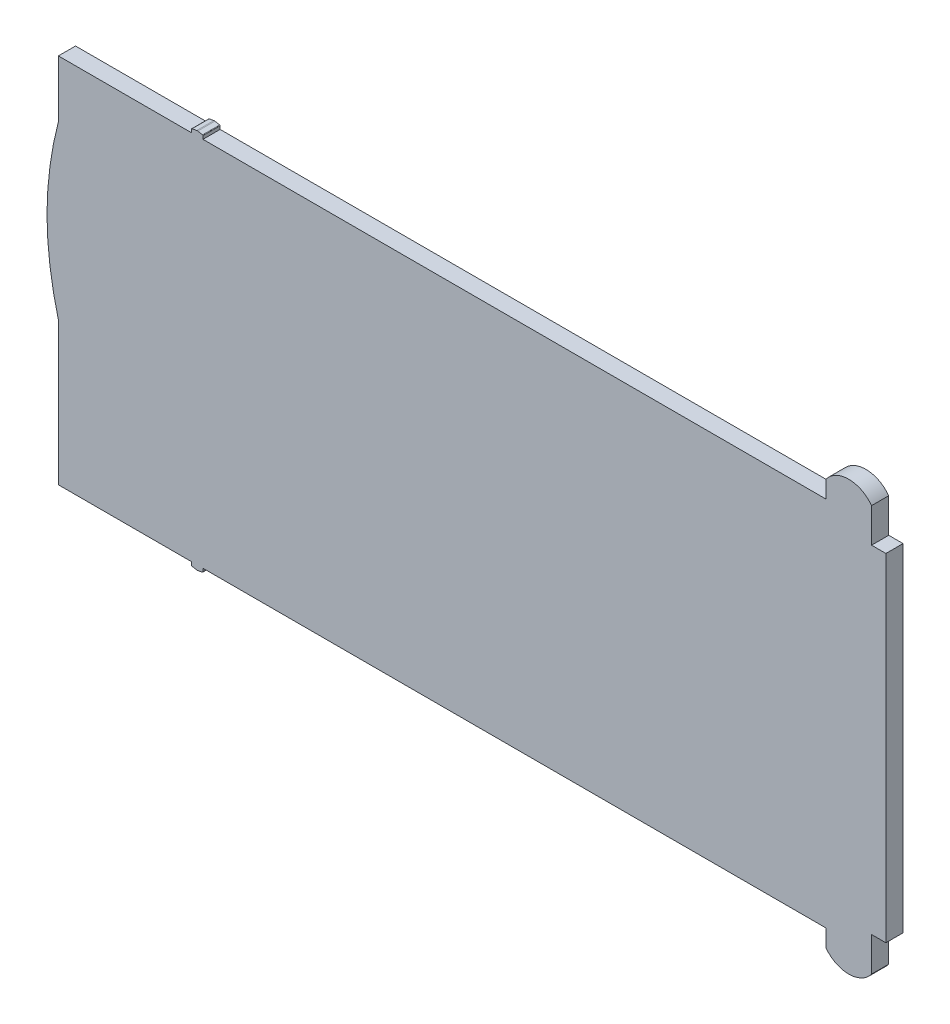
ISO-10303-21;
HEADER;
FILE_DESCRIPTION(('STEP AP214'),'2;1');
FILE_NAME('part.step','',(''),(''),'','','');
FILE_SCHEMA(('AUTOMOTIVE_DESIGN { 1 0 10303 214 1 1 1 1 }'));
ENDSEC;
DATA;
#1=APPLICATION_CONTEXT('core data for automotive mechanical design processes');
#2=APPLICATION_PROTOCOL_DEFINITION('international standard','automotive_design',2000,#1);
#3=PRODUCT_CONTEXT('',#1,'mechanical');
#4=PRODUCT('Part','Part','',(#3));
#5=PRODUCT_RELATED_PRODUCT_CATEGORY('part','',(#4));
#6=PRODUCT_DEFINITION_FORMATION('','',#4);
#7=PRODUCT_DEFINITION_CONTEXT('part definition',#1,'design');
#8=PRODUCT_DEFINITION('design','',#6,#7);
#9=PRODUCT_DEFINITION_SHAPE('','',#8);
#10=(LENGTH_UNIT() NAMED_UNIT(*) SI_UNIT(.MILLI.,.METRE.));
#11=(NAMED_UNIT(*) PLANE_ANGLE_UNIT() SI_UNIT($,.RADIAN.));
#12=(NAMED_UNIT(*) SI_UNIT($,.STERADIAN.) SOLID_ANGLE_UNIT());
#13=UNCERTAINTY_MEASURE_WITH_UNIT(LENGTH_MEASURE(1.E-05),#10,'distance_accuracy_value','');
#14=(GEOMETRIC_REPRESENTATION_CONTEXT(3) GLOBAL_UNCERTAINTY_ASSIGNED_CONTEXT((#13)) GLOBAL_UNIT_ASSIGNED_CONTEXT((#10,
#11,#12)) REPRESENTATION_CONTEXT('',''));
#15=CARTESIAN_POINT('',(0.,0.,0.));
#16=DIRECTION('',(0.,0.,1.));
#17=DIRECTION('',(1.,0.,0.));
#18=AXIS2_PLACEMENT_3D('',#15,#16,#17);
#19=CARTESIAN_POINT('',(10.7621231700087,0.,0.));
#20=DIRECTION('',(-1.,0.,0.));
#21=DIRECTION('',(0.,-1.,0.));
#22=AXIS2_PLACEMENT_3D('',#19,#20,#21);
#23=PLANE('',#22);
#24=DIRECTION('',(0.,1.,0.));
#25=VECTOR('',#24,1.);
#26=CARTESIAN_POINT('',(10.7621231700087,14.2169585415998,3.));
#27=LINE('',#26,#25);
#28=CARTESIAN_POINT('',(10.7621231700087,14.2169585415998,3.));
#29=VERTEX_POINT('',#28);
#30=CARTESIAN_POINT('',(10.7621231700086,39.2168168452358,3.));
#31=VERTEX_POINT('',#30);
#32=EDGE_CURVE('E249',#29,#31,#27,.T.);
#33=ORIENTED_EDGE('',*,*,#32,.T.);
#34=DIRECTION('',(0.,0.,-1.));
#35=VECTOR('',#34,1.);
#36=CARTESIAN_POINT('',(10.7621231700086,39.2168168452358,3.));
#37=LINE('',#36,#35);
#38=CARTESIAN_POINT('',(10.7621231700086,39.2168168452358,0.));
#39=VERTEX_POINT('',#38);
#40=EDGE_CURVE('E258',#31,#39,#37,.T.);
#41=ORIENTED_EDGE('',*,*,#40,.T.);
#42=DIRECTION('',(0.,-1.,0.));
#43=VECTOR('',#42,1.);
#44=CARTESIAN_POINT('',(10.7621231700086,79.2168168452358,0.));
#45=LINE('',#44,#43);
#46=CARTESIAN_POINT('',(10.7621231700087,14.2169585415998,0.));
#47=VERTEX_POINT('',#46);
#48=EDGE_CURVE('E276',#39,#47,#45,.T.);
#49=ORIENTED_EDGE('',*,*,#48,.T.);
#50=DIRECTION('',(0.,0.,1.));
#51=VECTOR('',#50,1.);
#52=CARTESIAN_POINT('',(10.7621231700087,14.2169585415998,0.));
#53=LINE('',#52,#51);
#54=EDGE_CURVE('E260',#47,#29,#53,.T.);
#55=ORIENTED_EDGE('',*,*,#54,.T.);
#56=EDGE_LOOP('',(#33,#41,#49,#55));
#57=FACE_BOUND('',#56,.T.);
#58=ADVANCED_FACE('F45',(#57),#23,.T.);
#59=CARTESIAN_POINT('',(0.,79.2168168452358,3.));
#60=DIRECTION('',(0.,-1.,0.));
#61=DIRECTION('',(0.,0.,-1.));
#62=AXIS2_PLACEMENT_3D('',#59,#60,#61);
#63=PLANE('',#62);
#64=DIRECTION('',(0.,0.,-1.));
#65=VECTOR('',#64,1.);
#66=CARTESIAN_POINT('',(10.7621231700086,79.2168168452358,3.));
#67=LINE('',#66,#65);
#68=CARTESIAN_POINT('',(10.7621231700086,79.2168168452358,3.));
#69=VERTEX_POINT('',#68);
#70=CARTESIAN_POINT('',(10.7621231700086,79.2168168452358,0.));
#71=VERTEX_POINT('',#70);
#72=EDGE_CURVE('E271',#69,#71,#67,.T.);
#73=ORIENTED_EDGE('',*,*,#72,.F.);
#74=DIRECTION('',(-1.,0.,0.));
#75=VECTOR('',#74,1.);
#76=CARTESIAN_POINT('',(0.,79.2168168452358,3.));
#77=LINE('',#76,#75);
#78=CARTESIAN_POINT('',(34.0621231763488,79.2168168452358,3.));
#79=VERTEX_POINT('',#78);
#80=EDGE_CURVE('E339',#79,#69,#77,.T.);
#81=ORIENTED_EDGE('',*,*,#80,.F.);
#82=DIRECTION('',(0.,0.,-1.));
#83=VECTOR('',#82,1.);
#84=CARTESIAN_POINT('',(34.0621231763488,79.2168168452358,3.));
#85=LINE('',#84,#83);
#86=CARTESIAN_POINT('',(34.0621231763488,79.2168168452358,0.));
#87=VERTEX_POINT('',#86);
#88=EDGE_CURVE('E493',#79,#87,#85,.T.);
#89=ORIENTED_EDGE('',*,*,#88,.T.);
#90=DIRECTION('',(-1.,0.,0.));
#91=VECTOR('',#90,1.);
#92=CARTESIAN_POINT('',(0.,79.2168168452358,0.));
#93=LINE('',#92,#91);
#94=EDGE_CURVE('E428',#87,#71,#93,.T.);
#95=ORIENTED_EDGE('',*,*,#94,.T.);
#96=EDGE_LOOP('',(#73,#81,#89,#95));
#97=FACE_BOUND('',#96,.T.);
#98=ADVANCED_FACE('F574',(#97),#63,.F.);
#99=CARTESIAN_POINT('',(0.,14.2169585415998,3.));
#100=DIRECTION('',(0.,1.,0.));
#101=DIRECTION('',(0.,0.,1.));
#102=AXIS2_PLACEMENT_3D('',#99,#100,#101);
#103=PLANE('',#102);
#104=ORIENTED_EDGE('',*,*,#54,.F.);
#105=DIRECTION('',(1.,0.,0.));
#106=VECTOR('',#105,1.);
#107=CARTESIAN_POINT('',(0.,14.2169585415998,0.));
#108=LINE('',#107,#106);
#109=CARTESIAN_POINT('',(34.0437288057142,14.2169585415998,0.));
#110=VERTEX_POINT('',#109);
#111=EDGE_CURVE('E432',#47,#110,#108,.T.);
#112=ORIENTED_EDGE('',*,*,#111,.T.);
#113=DIRECTION('',(0.,0.,-1.));
#114=VECTOR('',#113,1.);
#115=CARTESIAN_POINT('',(34.0437288057142,14.2169585415998,3.));
#116=LINE('',#115,#114);
#117=CARTESIAN_POINT('',(34.0437288057142,14.2169585415998,3.));
#118=VERTEX_POINT('',#117);
#119=EDGE_CURVE('E489',#118,#110,#116,.T.);
#120=ORIENTED_EDGE('',*,*,#119,.F.);
#121=DIRECTION('',(1.,0.,0.));
#122=VECTOR('',#121,1.);
#123=CARTESIAN_POINT('',(0.,14.2169585415998,3.));
#124=LINE('',#123,#122);
#125=EDGE_CURVE('E343',#29,#118,#124,.T.);
#126=ORIENTED_EDGE('',*,*,#125,.F.);
#127=EDGE_LOOP('',(#104,#112,#120,#126));
#128=FACE_BOUND('',#127,.T.);
#129=ADVANCED_FACE('F579',(#128),#103,.F.);
#130=CARTESIAN_POINT('',(0.,0.,3.));
#131=DIRECTION('',(0.,0.,1.));
#132=DIRECTION('',(1.,0.,0.));
#133=AXIS2_PLACEMENT_3D('',#130,#131,#132);
#134=PLANE('',#133);
#135=CARTESIAN_POINT('',(10.7621231700086,69.2168168452358,3.));
#136=VERTEX_POINT('',#135);
#137=EDGE_CURVE('E263',#136,#69,#27,.T.);
#138=ORIENTED_EDGE('',*,*,#137,.F.);
#139=CARTESIAN_POINT('',(68.7621231700086,53.8545253494986,3.));
#140=DIRECTION('',(0.,0.,1.));
#141=DIRECTION('',(1.,0.,0.));
#142=AXIS2_PLACEMENT_3D('',#139,#140,#141);
#143=CIRCLE('',#142,60.);
#144=CARTESIAN_POINT('',(8.76321697271102,54.2168168452358,3.));
#145=VERTEX_POINT('',#144);
#146=EDGE_CURVE('E11',#136,#145,#143,.T.);
#147=ORIENTED_EDGE('',*,*,#146,.T.);
#148=CARTESIAN_POINT('',(68.7621231700086,54.579108340973,3.));
#149=DIRECTION('',(0.,0.,1.));
#150=DIRECTION('',(1.,0.,0.));
#151=AXIS2_PLACEMENT_3D('',#148,#149,#150);
#152=CIRCLE('',#151,60.);
#153=EDGE_CURVE('E55',#145,#31,#152,.T.);
#154=ORIENTED_EDGE('',*,*,#153,.T.);
#155=ORIENTED_EDGE('',*,*,#32,.F.);
#156=ORIENTED_EDGE('',*,*,#125,.T.);
#157=DIRECTION('',(0.,-1.,0.));
#158=VECTOR('',#157,1.);
#159=CARTESIAN_POINT('',(34.0437288057142,0.,3.));
#160=LINE('',#159,#158);
#161=CARTESIAN_POINT('',(34.0437288057142,13.6715150038489,3.));
#162=VERTEX_POINT('',#161);
#163=EDGE_CURVE('E346',#118,#162,#160,.T.);
#164=ORIENTED_EDGE('',*,*,#163,.T.);
#165=CARTESIAN_POINT('',(34.1437288057406,13.6715150038489,3.));
#166=DIRECTION('',(0.,0.,1.));
#167=DIRECTION('',(1.,0.,0.));
#168=AXIS2_PLACEMENT_3D('',#165,#166,#167);
#169=CIRCLE('',#168,0.100000000026419);
#170=CARTESIAN_POINT('',(34.1252993326032,13.5732279013116,3.));
#171=VERTEX_POINT('',#170);
#172=EDGE_CURVE('E349',#162,#171,#169,.T.);
#173=ORIENTED_EDGE('',*,*,#172,.T.);
#174=DIRECTION('',(0.98287102511253,-0.184294731325244,0.));
#175=VECTOR('',#174,1.);
#176=CARTESIAN_POINT('',(3.6176770642929,19.2936061662692,3.));
#177=LINE('',#176,#175);
#178=CARTESIAN_POINT('',(34.9515482402403,13.4183008391131,3.));
#179=VERTEX_POINT('',#178);
#180=EDGE_CURVE('E352',#171,#179,#177,.T.);
#181=ORIENTED_EDGE('',*,*,#180,.T.);
#182=CARTESIAN_POINT('',(35.0436956059273,13.9097363517992,3.));
#183=DIRECTION('',(0.,0.,1.));
#184=DIRECTION('',(1.,0.,0.));
#185=AXIS2_PLACEMENT_3D('',#182,#183,#184);
#186=CIRCLE('',#185,0.500000000132089);
#187=CARTESIAN_POINT('',(35.1358398734767,13.4183002582022,3.));
#188=VERTEX_POINT('',#187);
#189=EDGE_CURVE('E355',#179,#188,#186,.T.);
#190=ORIENTED_EDGE('',*,*,#189,.T.);
#191=DIRECTION('',(-0.982872186934318,-0.184288535050205,0.));
#192=VECTOR('',#191,1.);
#193=CARTESIAN_POINT('',(-1.23719190012232,6.59835680065162,3.));
#194=LINE('',#193,#192);
#195=CARTESIAN_POINT('',(35.9621228561448,13.5732283174525,3.));
#196=VERTEX_POINT('',#195);
#197=EDGE_CURVE('E358',#196,#188,#194,.T.);
#198=ORIENTED_EDGE('',*,*,#197,.F.);
#199=CARTESIAN_POINT('',(35.9436940026349,13.6715155361719,3.));
#200=DIRECTION('',(0.,0.,1.));
#201=DIRECTION('',(1.,0.,0.));
#202=AXIS2_PLACEMENT_3D('',#199,#200,#201);
#203=CIRCLE('',#202,0.100000000026414);
#204=CARTESIAN_POINT('',(36.0436940026613,13.6715155361719,3.));
#205=VERTEX_POINT('',#204);
#206=EDGE_CURVE('E362',#196,#205,#203,.T.);
#207=ORIENTED_EDGE('',*,*,#206,.T.);
#208=DIRECTION('',(0.,1.,0.));
#209=VECTOR('',#208,1.);
#210=CARTESIAN_POINT('',(36.0436940026613,0.,3.));
#211=LINE('',#210,#209);
#212=CARTESIAN_POINT('',(36.0436940026613,14.2253015597027,3.));
#213=VERTEX_POINT('',#212);
#214=EDGE_CURVE('E365',#205,#213,#211,.T.);
#215=ORIENTED_EDGE('',*,*,#214,.T.);
#216=DIRECTION('',(0.999999997071696,-7.65284834121345E-05,0.));
#217=VECTOR('',#216,1.);
#218=CARTESIAN_POINT('',(0.00108885184507096,14.2280598456212,3.));
#219=LINE('',#218,#217);
#220=CARTESIAN_POINT('',(145.062162767235,14.2169585415998,3.));
#221=VERTEX_POINT('',#220);
#222=EDGE_CURVE('E368',#213,#221,#219,.T.);
#223=ORIENTED_EDGE('',*,*,#222,.T.);
#224=DIRECTION('',(0.,1.,0.));
#225=VECTOR('',#224,1.);
#226=CARTESIAN_POINT('',(145.062162767235,0.,3.));
#227=LINE('',#226,#225);
#228=CARTESIAN_POINT('',(145.062162767235,11.2169585408072,3.));
#229=VERTEX_POINT('',#228);
#230=EDGE_CURVE('E283',#229,#221,#227,.T.);
#231=ORIENTED_EDGE('',*,*,#230,.F.);
#232=CARTESIAN_POINT('',(149.062162768291,14.2169585415998,3.));
#233=DIRECTION('',(0.,0.,1.));
#234=DIRECTION('',(1.,0.,0.));
#235=AXIS2_PLACEMENT_3D('',#232,#233,#234);
#236=CIRCLE('',#235,5.00000000132089);
#237=CARTESIAN_POINT('',(153.062162769348,11.2169585408072,3.));
#238=VERTEX_POINT('',#237);
#239=EDGE_CURVE('E287',#229,#238,#236,.T.);
#240=ORIENTED_EDGE('',*,*,#239,.T.);
#241=DIRECTION('',(0.,1.,0.));
#242=VECTOR('',#241,1.);
#243=CARTESIAN_POINT('',(153.062162769348,0.,3.));
#244=LINE('',#243,#242);
#245=CARTESIAN_POINT('',(153.062162769348,17.2169585423923,3.));
#246=VERTEX_POINT('',#245);
#247=EDGE_CURVE('E291',#238,#246,#244,.T.);
#248=ORIENTED_EDGE('',*,*,#247,.T.);
#249=DIRECTION('',(1.,0.,0.));
#250=VECTOR('',#249,1.);
#251=CARTESIAN_POINT('',(0.,17.2169585423925,3.));
#252=LINE('',#251,#250);
#253=CARTESIAN_POINT('',(155.562162770009,17.2169585423923,3.));
#254=VERTEX_POINT('',#253);
#255=EDGE_CURVE('E294',#246,#254,#252,.T.);
#256=ORIENTED_EDGE('',*,*,#255,.T.);
#257=DIRECTION('',(0.,1.,0.));
#258=VECTOR('',#257,1.);
#259=CARTESIAN_POINT('',(155.562162770009,0.,3.));
#260=LINE('',#259,#258);
#261=CARTESIAN_POINT('',(155.562162770009,76.2168168444433,3.));
#262=VERTEX_POINT('',#261);
#263=EDGE_CURVE('E297',#254,#262,#260,.T.);
#264=ORIENTED_EDGE('',*,*,#263,.T.);
#265=DIRECTION('',(1.,0.,0.));
#266=VECTOR('',#265,1.);
#267=CARTESIAN_POINT('',(0.,76.2168168444433,3.));
#268=LINE('',#267,#266);
#269=CARTESIAN_POINT('',(153.062162769348,76.2168168444433,3.));
#270=VERTEX_POINT('',#269);
#271=EDGE_CURVE('E300',#270,#262,#268,.T.);
#272=ORIENTED_EDGE('',*,*,#271,.F.);
#273=DIRECTION('',(0.,-1.,0.));
#274=VECTOR('',#273,1.);
#275=CARTESIAN_POINT('',(153.062162769348,0.,3.));
#276=LINE('',#275,#274);
#277=CARTESIAN_POINT('',(153.062162769348,82.2168168460283,3.));
#278=VERTEX_POINT('',#277);
#279=EDGE_CURVE('E304',#278,#270,#276,.T.);
#280=ORIENTED_EDGE('',*,*,#279,.F.);
#281=CARTESIAN_POINT('',(149.062162768291,79.2165106796428,3.));
#282=DIRECTION('',(0.,0.,1.));
#283=DIRECTION('',(1.,0.,0.));
#284=AXIS2_PLACEMENT_3D('',#281,#282,#283);
#285=CIRCLE('',#284,5.00018370667568);
#286=CARTESIAN_POINT('',(145.062162767235,82.2168168460283,3.));
#287=VERTEX_POINT('',#286);
#288=EDGE_CURVE('E308',#278,#287,#285,.T.);
#289=ORIENTED_EDGE('',*,*,#288,.T.);
#290=DIRECTION('',(0.,-1.,0.));
#291=VECTOR('',#290,1.);
#292=CARTESIAN_POINT('',(145.062162767235,0.,3.));
#293=LINE('',#292,#291);
#294=CARTESIAN_POINT('',(145.062162767235,79.2168168452358,3.));
#295=VERTEX_POINT('',#294);
#296=EDGE_CURVE('E311',#287,#295,#293,.T.);
#297=ORIENTED_EDGE('',*,*,#296,.T.);
#298=DIRECTION('',(-0.999999997070707,7.65413980204859E-05,0.));
#299=VECTOR('',#298,1.);
#300=CARTESIAN_POINT('',(0.00606421574940523,79.2279196418429,3.));
#301=LINE('',#300,#299);
#302=CARTESIAN_POINT('',(36.062088373296,79.2251598633387,3.));
#303=VERTEX_POINT('',#302);
#304=EDGE_CURVE('E314',#295,#303,#301,.T.);
#305=ORIENTED_EDGE('',*,*,#304,.T.);
#306=DIRECTION('',(0.,1.,0.));
#307=VECTOR('',#306,1.);
#308=CARTESIAN_POINT('',(36.062088373296,0.,3.));
#309=LINE('',#308,#307);
#310=CARTESIAN_POINT('',(36.062088373296,79.7706034010896,3.));
#311=VERTEX_POINT('',#310);
#312=EDGE_CURVE('E317',#303,#311,#309,.T.);
#313=ORIENTED_EDGE('',*,*,#312,.T.);
#314=CARTESIAN_POINT('',(35.9620883732696,79.7706034010896,3.));
#315=DIRECTION('',(0.,0.,1.));
#316=DIRECTION('',(1.,0.,0.));
#317=AXIS2_PLACEMENT_3D('',#314,#315,#316);
#318=CIRCLE('',#317,0.100000000026418);
#319=CARTESIAN_POINT('',(35.980517846407,79.8688905036269,3.));
#320=VERTEX_POINT('',#319);
#321=EDGE_CURVE('E320',#311,#320,#318,.T.);
#322=ORIENTED_EDGE('',*,*,#321,.T.);
#323=DIRECTION('',(-0.98287102511253,0.184294731325246,0.));
#324=VECTOR('',#323,1.);
#325=CARTESIAN_POINT('',(15.6893492396954,83.6736170354941,3.));
#326=LINE('',#325,#324);
#327=CARTESIAN_POINT('',(35.1542689387699,80.0238175658254,3.));
#328=VERTEX_POINT('',#327);
#329=EDGE_CURVE('E323',#320,#328,#326,.T.);
#330=ORIENTED_EDGE('',*,*,#329,.T.);
#331=CARTESIAN_POINT('',(35.0621215730829,79.5323820531393,3.));
#332=DIRECTION('',(0.,0.,1.));
#333=DIRECTION('',(1.,0.,0.));
#334=AXIS2_PLACEMENT_3D('',#331,#332,#333);
#335=CIRCLE('',#334,0.500000000132074);
#336=CARTESIAN_POINT('',(34.9699773055335,80.0238181467363,3.));
#337=VERTEX_POINT('',#336);
#338=EDGE_CURVE('E326',#328,#337,#335,.T.);
#339=ORIENTED_EDGE('',*,*,#338,.T.);
#340=DIRECTION('',(0.982872186934325,0.184288535050171,0.));
#341=VECTOR('',#340,1.);
#342=CARTESIAN_POINT('',(-13.3072206614842,70.9718435279212,3.));
#343=LINE('',#342,#341);
#344=CARTESIAN_POINT('',(34.1436943228654,79.868890087486,3.));
#345=VERTEX_POINT('',#344);
#346=EDGE_CURVE('E329',#345,#337,#343,.T.);
#347=ORIENTED_EDGE('',*,*,#346,.F.);
#348=CARTESIAN_POINT('',(34.1621231763752,79.7706028687666,3.));
#349=DIRECTION('',(0.,0.,1.));
#350=DIRECTION('',(1.,0.,0.));
#351=AXIS2_PLACEMENT_3D('',#348,#349,#350);
#352=CIRCLE('',#351,0.100000000026419);
#353=CARTESIAN_POINT('',(34.0621231763488,79.7706028687666,3.));
#354=VERTEX_POINT('',#353);
#355=EDGE_CURVE('E333',#345,#354,#352,.T.);
#356=ORIENTED_EDGE('',*,*,#355,.T.);
#357=DIRECTION('',(0.,-1.,0.));
#358=VECTOR('',#357,1.);
#359=CARTESIAN_POINT('',(34.0621231763488,0.,3.));
#360=LINE('',#359,#358);
#361=EDGE_CURVE('E336',#354,#79,#360,.T.);
#362=ORIENTED_EDGE('',*,*,#361,.T.);
#363=ORIENTED_EDGE('',*,*,#80,.T.);
#364=EDGE_LOOP('',(#138,#147,#154,#155,#156,#164,#173,#181,#190,#198,#207,#215,#223,#231,#240,
#248,#256,#264,#272,#280,#289,#297,#305,#313,#322,#330,#339,#347,#356,#362,#363));
#365=FACE_BOUND('',#364,.T.);
#366=ADVANCED_FACE('F248',(#365),#134,.T.);
#367=CARTESIAN_POINT('',(0.,0.,0.));
#368=DIRECTION('',(0.,0.,1.));
#369=DIRECTION('',(1.,0.,0.));
#370=AXIS2_PLACEMENT_3D('',#367,#368,#369);
#371=PLANE('',#370);
#372=CARTESIAN_POINT('',(68.7621231700086,54.579108340973,0.));
#373=DIRECTION('',(0.,0.,1.));
#374=DIRECTION('',(1.,0.,0.));
#375=AXIS2_PLACEMENT_3D('',#372,#373,#374);
#376=CIRCLE('',#375,60.);
#377=CARTESIAN_POINT('',(8.76321697271102,54.2168168452358,0.));
#378=VERTEX_POINT('',#377);
#379=EDGE_CURVE('E68',#39,#378,#376,.F.);
#380=ORIENTED_EDGE('',*,*,#379,.T.);
#381=CARTESIAN_POINT('',(68.7621231700086,53.8545253494986,0.));
#382=DIRECTION('',(0.,0.,1.));
#383=DIRECTION('',(1.,0.,0.));
#384=AXIS2_PLACEMENT_3D('',#381,#382,#383);
#385=CIRCLE('',#384,60.);
#386=CARTESIAN_POINT('',(10.7621231700086,69.2168168452358,0.));
#387=VERTEX_POINT('',#386);
#388=EDGE_CURVE('E255',#378,#387,#385,.F.);
#389=ORIENTED_EDGE('',*,*,#388,.T.);
#390=EDGE_CURVE('E277',#71,#387,#45,.T.);
#391=ORIENTED_EDGE('',*,*,#390,.F.);
#392=ORIENTED_EDGE('',*,*,#94,.F.);
#393=DIRECTION('',(0.,-1.,0.));
#394=VECTOR('',#393,1.);
#395=CARTESIAN_POINT('',(34.0621231763488,0.,0.));
#396=LINE('',#395,#394);
#397=CARTESIAN_POINT('',(34.0621231763488,79.7706028687666,0.));
#398=VERTEX_POINT('',#397);
#399=EDGE_CURVE('E425',#398,#87,#396,.T.);
#400=ORIENTED_EDGE('',*,*,#399,.F.);
#401=CARTESIAN_POINT('',(34.1621231763752,79.7706028687666,0.));
#402=DIRECTION('',(0.,0.,1.));
#403=DIRECTION('',(1.,0.,0.));
#404=AXIS2_PLACEMENT_3D('',#401,#402,#403);
#405=CIRCLE('',#404,0.100000000026419);
#406=CARTESIAN_POINT('',(34.1436943228654,79.868890087486,0.));
#407=VERTEX_POINT('',#406);
#408=EDGE_CURVE('E422',#407,#398,#405,.T.);
#409=ORIENTED_EDGE('',*,*,#408,.F.);
#410=DIRECTION('',(0.982872186934325,0.184288535050171,0.));
#411=VECTOR('',#410,1.);
#412=CARTESIAN_POINT('',(-13.3072206614842,70.9718435279212,0.));
#413=LINE('',#412,#411);
#414=CARTESIAN_POINT('',(34.9699773055335,80.0238181467363,0.));
#415=VERTEX_POINT('',#414);
#416=EDGE_CURVE('E418',#407,#415,#413,.T.);
#417=ORIENTED_EDGE('',*,*,#416,.T.);
#418=CARTESIAN_POINT('',(35.0621215730829,79.5323820531393,0.));
#419=DIRECTION('',(0.,0.,1.));
#420=DIRECTION('',(1.,0.,0.));
#421=AXIS2_PLACEMENT_3D('',#418,#419,#420);
#422=CIRCLE('',#421,0.500000000132074);
#423=CARTESIAN_POINT('',(35.1542689387699,80.0238175658254,0.));
#424=VERTEX_POINT('',#423);
#425=EDGE_CURVE('E414',#424,#415,#422,.T.);
#426=ORIENTED_EDGE('',*,*,#425,.F.);
#427=DIRECTION('',(-0.98287102511253,0.184294731325246,0.));
#428=VECTOR('',#427,1.);
#429=CARTESIAN_POINT('',(15.6893492396954,83.6736170354941,0.));
#430=LINE('',#429,#428);
#431=CARTESIAN_POINT('',(35.980517846407,79.8688905036269,0.));
#432=VERTEX_POINT('',#431);
#433=EDGE_CURVE('E411',#432,#424,#430,.T.);
#434=ORIENTED_EDGE('',*,*,#433,.F.);
#435=CARTESIAN_POINT('',(35.9620883732696,79.7706034010896,0.));
#436=DIRECTION('',(0.,0.,1.));
#437=DIRECTION('',(1.,0.,0.));
#438=AXIS2_PLACEMENT_3D('',#435,#436,#437);
#439=CIRCLE('',#438,0.100000000026418);
#440=CARTESIAN_POINT('',(36.062088373296,79.7706034010896,0.));
#441=VERTEX_POINT('',#440);
#442=EDGE_CURVE('E408',#441,#432,#439,.T.);
#443=ORIENTED_EDGE('',*,*,#442,.F.);
#444=DIRECTION('',(0.,1.,0.));
#445=VECTOR('',#444,1.);
#446=CARTESIAN_POINT('',(36.062088373296,0.,0.));
#447=LINE('',#446,#445);
#448=CARTESIAN_POINT('',(36.062088373296,79.2251598633387,0.));
#449=VERTEX_POINT('',#448);
#450=EDGE_CURVE('E405',#449,#441,#447,.T.);
#451=ORIENTED_EDGE('',*,*,#450,.F.);
#452=DIRECTION('',(-0.999999997070707,7.65413980204859E-05,0.));
#453=VECTOR('',#452,1.);
#454=CARTESIAN_POINT('',(0.00606421574940523,79.2279196418429,0.));
#455=LINE('',#454,#453);
#456=CARTESIAN_POINT('',(145.062162767235,79.2168168452358,0.));
#457=VERTEX_POINT('',#456);
#458=EDGE_CURVE('E402',#457,#449,#455,.T.);
#459=ORIENTED_EDGE('',*,*,#458,.F.);
#460=DIRECTION('',(0.,-1.,0.));
#461=VECTOR('',#460,1.);
#462=CARTESIAN_POINT('',(145.062162767235,0.,0.));
#463=LINE('',#462,#461);
#464=CARTESIAN_POINT('',(145.062162767235,82.2168168460283,0.));
#465=VERTEX_POINT('',#464);
#466=EDGE_CURVE('E399',#465,#457,#463,.T.);
#467=ORIENTED_EDGE('',*,*,#466,.F.);
#468=CARTESIAN_POINT('',(149.062162768291,79.2165106796428,0.));
#469=DIRECTION('',(0.,0.,1.));
#470=DIRECTION('',(1.,0.,0.));
#471=AXIS2_PLACEMENT_3D('',#468,#469,#470);
#472=CIRCLE('',#471,5.00018370667568);
#473=CARTESIAN_POINT('',(153.062162769348,82.2168168460283,0.));
#474=VERTEX_POINT('',#473);
#475=EDGE_CURVE('E396',#474,#465,#472,.T.);
#476=ORIENTED_EDGE('',*,*,#475,.F.);
#477=DIRECTION('',(0.,-1.,0.));
#478=VECTOR('',#477,1.);
#479=CARTESIAN_POINT('',(153.062162769348,0.,0.));
#480=LINE('',#479,#478);
#481=CARTESIAN_POINT('',(153.062162769348,76.2168168444433,0.));
#482=VERTEX_POINT('',#481);
#483=EDGE_CURVE('E392',#474,#482,#480,.T.);
#484=ORIENTED_EDGE('',*,*,#483,.T.);
#485=DIRECTION('',(1.,0.,0.));
#486=VECTOR('',#485,1.);
#487=CARTESIAN_POINT('',(0.,76.2168168444433,0.));
#488=LINE('',#487,#486);
#489=CARTESIAN_POINT('',(155.562162770009,76.2168168444433,0.));
#490=VERTEX_POINT('',#489);
#491=EDGE_CURVE('E388',#482,#490,#488,.T.);
#492=ORIENTED_EDGE('',*,*,#491,.T.);
#493=DIRECTION('',(0.,1.,0.));
#494=VECTOR('',#493,1.);
#495=CARTESIAN_POINT('',(155.562162770009,0.,0.));
#496=LINE('',#495,#494);
#497=CARTESIAN_POINT('',(155.562162770009,17.2169585423923,0.));
#498=VERTEX_POINT('',#497);
#499=EDGE_CURVE('E384',#498,#490,#496,.T.);
#500=ORIENTED_EDGE('',*,*,#499,.F.);
#501=DIRECTION('',(1.,0.,0.));
#502=VECTOR('',#501,1.);
#503=CARTESIAN_POINT('',(0.,17.2169585423925,0.));
#504=LINE('',#503,#502);
#505=CARTESIAN_POINT('',(153.062162769348,17.2169585423923,0.));
#506=VERTEX_POINT('',#505);
#507=EDGE_CURVE('E381',#506,#498,#504,.T.);
#508=ORIENTED_EDGE('',*,*,#507,.F.);
#509=DIRECTION('',(0.,1.,0.));
#510=VECTOR('',#509,1.);
#511=CARTESIAN_POINT('',(153.062162769348,0.,0.));
#512=LINE('',#511,#510);
#513=CARTESIAN_POINT('',(153.062162769348,11.2169585408072,0.));
#514=VERTEX_POINT('',#513);
#515=EDGE_CURVE('E378',#514,#506,#512,.T.);
#516=ORIENTED_EDGE('',*,*,#515,.F.);
#517=CARTESIAN_POINT('',(149.062162768291,14.2169585415998,0.));
#518=DIRECTION('',(0.,0.,1.));
#519=DIRECTION('',(1.,0.,0.));
#520=AXIS2_PLACEMENT_3D('',#517,#518,#519);
#521=CIRCLE('',#520,5.00000000132089);
#522=CARTESIAN_POINT('',(145.062162767235,11.2169585408072,0.));
#523=VERTEX_POINT('',#522);
#524=EDGE_CURVE('E375',#523,#514,#521,.T.);
#525=ORIENTED_EDGE('',*,*,#524,.F.);
#526=DIRECTION('',(0.,1.,0.));
#527=VECTOR('',#526,1.);
#528=CARTESIAN_POINT('',(145.062162767235,0.,0.));
#529=LINE('',#528,#527);
#530=CARTESIAN_POINT('',(145.062162767235,14.2169585415998,0.));
#531=VERTEX_POINT('',#530);
#532=EDGE_CURVE('E262',#523,#531,#529,.T.);
#533=ORIENTED_EDGE('',*,*,#532,.T.);
#534=DIRECTION('',(0.999999997071696,-7.65284834121345E-05,0.));
#535=VECTOR('',#534,1.);
#536=CARTESIAN_POINT('',(0.00108885184507096,14.2280598456212,0.));
#537=LINE('',#536,#535);
#538=CARTESIAN_POINT('',(36.0436940026613,14.2253015597027,0.));
#539=VERTEX_POINT('',#538);
#540=EDGE_CURVE('E288',#539,#531,#537,.T.);
#541=ORIENTED_EDGE('',*,*,#540,.F.);
#542=DIRECTION('',(0.,1.,0.));
#543=VECTOR('',#542,1.);
#544=CARTESIAN_POINT('',(36.0436940026613,0.,0.));
#545=LINE('',#544,#543);
#546=CARTESIAN_POINT('',(36.0436940026613,13.6715155361719,0.));
#547=VERTEX_POINT('',#546);
#548=EDGE_CURVE('E455',#547,#539,#545,.T.);
#549=ORIENTED_EDGE('',*,*,#548,.F.);
#550=CARTESIAN_POINT('',(35.9436940026349,13.6715155361719,0.));
#551=DIRECTION('',(0.,0.,1.));
#552=DIRECTION('',(1.,0.,0.));
#553=AXIS2_PLACEMENT_3D('',#550,#551,#552);
#554=CIRCLE('',#553,0.100000000026414);
#555=CARTESIAN_POINT('',(35.9621228561448,13.5732283174525,0.));
#556=VERTEX_POINT('',#555);
#557=EDGE_CURVE('E452',#556,#547,#554,.T.);
#558=ORIENTED_EDGE('',*,*,#557,.F.);
#559=DIRECTION('',(-0.982872186934318,-0.184288535050205,0.));
#560=VECTOR('',#559,1.);
#561=CARTESIAN_POINT('',(-1.23719190012232,6.59835680065162,0.));
#562=LINE('',#561,#560);
#563=CARTESIAN_POINT('',(35.1358398734767,13.4183002582022,0.));
#564=VERTEX_POINT('',#563);
#565=EDGE_CURVE('E448',#556,#564,#562,.T.);
#566=ORIENTED_EDGE('',*,*,#565,.T.);
#567=CARTESIAN_POINT('',(35.0436956059273,13.9097363517992,0.));
#568=DIRECTION('',(0.,0.,1.));
#569=DIRECTION('',(1.,0.,0.));
#570=AXIS2_PLACEMENT_3D('',#567,#568,#569);
#571=CIRCLE('',#570,0.500000000132089);
#572=CARTESIAN_POINT('',(34.9515482402403,13.4183008391131,0.));
#573=VERTEX_POINT('',#572);
#574=EDGE_CURVE('E444',#573,#564,#571,.T.);
#575=ORIENTED_EDGE('',*,*,#574,.F.);
#576=DIRECTION('',(0.98287102511253,-0.184294731325244,0.));
#577=VECTOR('',#576,1.);
#578=CARTESIAN_POINT('',(3.6176770642929,19.2936061662692,0.));
#579=LINE('',#578,#577);
#580=CARTESIAN_POINT('',(34.1252993326032,13.5732279013116,0.));
#581=VERTEX_POINT('',#580);
#582=EDGE_CURVE('E441',#581,#573,#579,.T.);
#583=ORIENTED_EDGE('',*,*,#582,.F.);
#584=CARTESIAN_POINT('',(34.1437288057406,13.6715150038489,0.));
#585=DIRECTION('',(0.,0.,1.));
#586=DIRECTION('',(1.,0.,0.));
#587=AXIS2_PLACEMENT_3D('',#584,#585,#586);
#588=CIRCLE('',#587,0.100000000026419);
#589=CARTESIAN_POINT('',(34.0437288057142,13.6715150038489,0.));
#590=VERTEX_POINT('',#589);
#591=EDGE_CURVE('E438',#590,#581,#588,.T.);
#592=ORIENTED_EDGE('',*,*,#591,.F.);
#593=DIRECTION('',(0.,-1.,0.));
#594=VECTOR('',#593,1.);
#595=CARTESIAN_POINT('',(34.0437288057142,0.,0.));
#596=LINE('',#595,#594);
#597=EDGE_CURVE('E435',#110,#590,#596,.T.);
#598=ORIENTED_EDGE('',*,*,#597,.F.);
#599=ORIENTED_EDGE('',*,*,#111,.F.);
#600=ORIENTED_EDGE('',*,*,#48,.F.);
#601=EDGE_LOOP('',(#380,#389,#391,#392,#400,#409,#417,#426,#434,#443,#451,#459,#467,#476,#484,
#492,#500,#508,#516,#525,#533,#541,#549,#558,#566,#575,#583,#592,#598,#599,#600));
#602=FACE_BOUND('',#601,.T.);
#603=ADVANCED_FACE('F560',(#602),#371,.F.);
#604=CARTESIAN_POINT('',(145.062162767235,0.,3.));
#605=DIRECTION('',(-1.,0.,0.));
#606=DIRECTION('',(0.,0.,1.));
#607=AXIS2_PLACEMENT_3D('',#604,#605,#606);
#608=PLANE('',#607);
#609=ORIENTED_EDGE('',*,*,#532,.F.);
#610=DIRECTION('',(0.,0.,-1.));
#611=VECTOR('',#610,1.);
#612=CARTESIAN_POINT('',(145.062162767235,11.2169585408072,3.));
#613=LINE('',#612,#611);
#614=EDGE_CURVE('E552',#229,#523,#613,.T.);
#615=ORIENTED_EDGE('',*,*,#614,.F.);
#616=ORIENTED_EDGE('',*,*,#230,.T.);
#617=DIRECTION('',(0.,0.,-1.));
#618=VECTOR('',#617,1.);
#619=CARTESIAN_POINT('',(145.062162767235,14.2169585415998,3.));
#620=LINE('',#619,#618);
#621=EDGE_CURVE('E371',#221,#531,#620,.T.);
#622=ORIENTED_EDGE('',*,*,#621,.T.);
#623=EDGE_LOOP('',(#609,#615,#616,#622));
#624=FACE_BOUND('',#623,.T.);
#625=ADVANCED_FACE('F687',(#624),#608,.T.);
#626=CARTESIAN_POINT('',(149.062162768291,14.2169585415998,3.));
#627=DIRECTION('',(0.,0.,-1.));
#628=DIRECTION('',(-1.,0.,0.));
#629=AXIS2_PLACEMENT_3D('',#626,#627,#628);
#630=CYLINDRICAL_SURFACE('',#629,5.00000000132089);
#631=ORIENTED_EDGE('',*,*,#524,.T.);
#632=DIRECTION('',(0.,0.,-1.));
#633=VECTOR('',#632,1.);
#634=CARTESIAN_POINT('',(153.062162769348,11.2169585408072,3.));
#635=LINE('',#634,#633);
#636=EDGE_CURVE('E548',#238,#514,#635,.T.);
#637=ORIENTED_EDGE('',*,*,#636,.F.);
#638=ORIENTED_EDGE('',*,*,#239,.F.);
#639=ORIENTED_EDGE('',*,*,#614,.T.);
#640=EDGE_LOOP('',(#631,#637,#638,#639));
#641=FACE_BOUND('',#640,.T.);
#642=ADVANCED_FACE('F684',(#641),#630,.T.);
#643=CARTESIAN_POINT('',(153.062162769348,0.,3.));
#644=DIRECTION('',(-1.,0.,0.));
#645=DIRECTION('',(0.,0.,1.));
#646=AXIS2_PLACEMENT_3D('',#643,#644,#645);
#647=PLANE('',#646);
#648=ORIENTED_EDGE('',*,*,#515,.T.);
#649=DIRECTION('',(0.,0.,-1.));
#650=VECTOR('',#649,1.);
#651=CARTESIAN_POINT('',(153.062162769348,17.2169585423923,3.));
#652=LINE('',#651,#650);
#653=EDGE_CURVE('E544',#246,#506,#652,.T.);
#654=ORIENTED_EDGE('',*,*,#653,.F.);
#655=ORIENTED_EDGE('',*,*,#247,.F.);
#656=ORIENTED_EDGE('',*,*,#636,.T.);
#657=EDGE_LOOP('',(#648,#654,#655,#656));
#658=FACE_BOUND('',#657,.T.);
#659=ADVANCED_FACE('F680',(#658),#647,.F.);
#660=CARTESIAN_POINT('',(0.,17.2169585423925,3.));
#661=DIRECTION('',(0.,1.,0.));
#662=DIRECTION('',(-1.,0.,0.));
#663=AXIS2_PLACEMENT_3D('',#660,#661,#662);
#664=PLANE('',#663);
#665=ORIENTED_EDGE('',*,*,#507,.T.);
#666=DIRECTION('',(0.,0.,-1.));
#667=VECTOR('',#666,1.);
#668=CARTESIAN_POINT('',(155.562162770009,17.2169585423923,3.));
#669=LINE('',#668,#667);
#670=EDGE_CURVE('E540',#254,#498,#669,.T.);
#671=ORIENTED_EDGE('',*,*,#670,.F.);
#672=ORIENTED_EDGE('',*,*,#255,.F.);
#673=ORIENTED_EDGE('',*,*,#653,.T.);
#674=EDGE_LOOP('',(#665,#671,#672,#673));
#675=FACE_BOUND('',#674,.T.);
#676=ADVANCED_FACE('F676',(#675),#664,.F.);
#677=CARTESIAN_POINT('',(155.562162770009,0.,3.));
#678=DIRECTION('',(-1.,0.,0.));
#679=DIRECTION('',(0.,-1.,0.));
#680=AXIS2_PLACEMENT_3D('',#677,#678,#679);
#681=PLANE('',#680);
#682=ORIENTED_EDGE('',*,*,#499,.T.);
#683=DIRECTION('',(0.,0.,-1.));
#684=VECTOR('',#683,1.);
#685=CARTESIAN_POINT('',(155.562162770009,76.2168168444433,3.));
#686=LINE('',#685,#684);
#687=EDGE_CURVE('E537',#262,#490,#686,.T.);
#688=ORIENTED_EDGE('',*,*,#687,.F.);
#689=ORIENTED_EDGE('',*,*,#263,.F.);
#690=ORIENTED_EDGE('',*,*,#670,.T.);
#691=EDGE_LOOP('',(#682,#688,#689,#690));
#692=FACE_BOUND('',#691,.T.);
#693=ADVANCED_FACE('F672',(#692),#681,.F.);
#694=CARTESIAN_POINT('',(0.,76.2168168444433,3.));
#695=DIRECTION('',(0.,1.,0.));
#696=DIRECTION('',(0.,0.,1.));
#697=AXIS2_PLACEMENT_3D('',#694,#695,#696);
#698=PLANE('',#697);
#699=ORIENTED_EDGE('',*,*,#491,.F.);
#700=DIRECTION('',(0.,0.,-1.));
#701=VECTOR('',#700,1.);
#702=CARTESIAN_POINT('',(153.062162769348,76.2168168444433,3.));
#703=LINE('',#702,#701);
#704=EDGE_CURVE('E534',#270,#482,#703,.T.);
#705=ORIENTED_EDGE('',*,*,#704,.F.);
#706=ORIENTED_EDGE('',*,*,#271,.T.);
#707=ORIENTED_EDGE('',*,*,#687,.T.);
#708=EDGE_LOOP('',(#699,#705,#706,#707));
#709=FACE_BOUND('',#708,.T.);
#710=ADVANCED_FACE('F668',(#709),#698,.T.);
#711=CARTESIAN_POINT('',(153.062162769348,0.,3.));
#712=DIRECTION('',(1.,0.,0.));
#713=DIRECTION('',(0.,0.,-1.));
#714=AXIS2_PLACEMENT_3D('',#711,#712,#713);
#715=PLANE('',#714);
#716=ORIENTED_EDGE('',*,*,#483,.F.);
#717=DIRECTION('',(0.,0.,-1.));
#718=VECTOR('',#717,1.);
#719=CARTESIAN_POINT('',(153.062162769348,82.2168168460283,3.));
#720=LINE('',#719,#718);
#721=EDGE_CURVE('E531',#278,#474,#720,.T.);
#722=ORIENTED_EDGE('',*,*,#721,.F.);
#723=ORIENTED_EDGE('',*,*,#279,.T.);
#724=ORIENTED_EDGE('',*,*,#704,.T.);
#725=EDGE_LOOP('',(#716,#722,#723,#724));
#726=FACE_BOUND('',#725,.T.);
#727=ADVANCED_FACE('F664',(#726),#715,.T.);
#728=CARTESIAN_POINT('',(149.062162768291,79.2165106796428,3.));
#729=DIRECTION('',(0.,0.,-1.));
#730=DIRECTION('',(-1.,0.,0.));
#731=AXIS2_PLACEMENT_3D('',#728,#729,#730);
#732=CYLINDRICAL_SURFACE('',#731,5.00018370667568);
#733=ORIENTED_EDGE('',*,*,#475,.T.);
#734=DIRECTION('',(0.,0.,-1.));
#735=VECTOR('',#734,1.);
#736=CARTESIAN_POINT('',(145.062162767235,82.2168168460283,3.));
#737=LINE('',#736,#735);
#738=EDGE_CURVE('E527',#287,#465,#737,.T.);
#739=ORIENTED_EDGE('',*,*,#738,.F.);
#740=ORIENTED_EDGE('',*,*,#288,.F.);
#741=ORIENTED_EDGE('',*,*,#721,.T.);
#742=EDGE_LOOP('',(#733,#739,#740,#741));
#743=FACE_BOUND('',#742,.T.);
#744=ADVANCED_FACE('F660',(#743),#732,.T.);
#745=CARTESIAN_POINT('',(145.062162767235,0.,3.));
#746=DIRECTION('',(1.,0.,0.));
#747=DIRECTION('',(0.,0.,-1.));
#748=AXIS2_PLACEMENT_3D('',#745,#746,#747);
#749=PLANE('',#748);
#750=ORIENTED_EDGE('',*,*,#466,.T.);
#751=DIRECTION('',(0.,0.,-1.));
#752=VECTOR('',#751,1.);
#753=CARTESIAN_POINT('',(145.062162767235,79.2168168452358,3.));
#754=LINE('',#753,#752);
#755=EDGE_CURVE('E523',#295,#457,#754,.T.);
#756=ORIENTED_EDGE('',*,*,#755,.F.);
#757=ORIENTED_EDGE('',*,*,#296,.F.);
#758=ORIENTED_EDGE('',*,*,#738,.T.);
#759=EDGE_LOOP('',(#750,#756,#757,#758));
#760=FACE_BOUND('',#759,.T.);
#761=ADVANCED_FACE('F656',(#760),#749,.F.);
#762=CARTESIAN_POINT('',(0.00606421574940523,79.2279196418429,3.));
#763=DIRECTION('',(-7.65413980204859E-05,-0.999999997070707,0.));
#764=DIRECTION('',(0.999999997070707,-7.65413980204859E-05,0.));
#765=AXIS2_PLACEMENT_3D('',#762,#763,#764);
#766=PLANE('',#765);
#767=ORIENTED_EDGE('',*,*,#458,.T.);
#768=DIRECTION('',(0.,0.,-1.));
#769=VECTOR('',#768,1.);
#770=CARTESIAN_POINT('',(36.062088373296,79.2251598633387,3.));
#771=LINE('',#770,#769);
#772=EDGE_CURVE('E519',#303,#449,#771,.T.);
#773=ORIENTED_EDGE('',*,*,#772,.F.);
#774=ORIENTED_EDGE('',*,*,#304,.F.);
#775=ORIENTED_EDGE('',*,*,#755,.T.);
#776=EDGE_LOOP('',(#767,#773,#774,#775));
#777=FACE_BOUND('',#776,.T.);
#778=ADVANCED_FACE('F652',(#777),#766,.F.);
#779=CARTESIAN_POINT('',(36.062088373296,0.,3.));
#780=DIRECTION('',(-1.,0.,0.));
#781=DIRECTION('',(0.,0.,1.));
#782=AXIS2_PLACEMENT_3D('',#779,#780,#781);
#783=PLANE('',#782);
#784=ORIENTED_EDGE('',*,*,#450,.T.);
#785=DIRECTION('',(0.,0.,-1.));
#786=VECTOR('',#785,1.);
#787=CARTESIAN_POINT('',(36.062088373296,79.7706034010896,3.));
#788=LINE('',#787,#786);
#789=EDGE_CURVE('E515',#311,#441,#788,.T.);
#790=ORIENTED_EDGE('',*,*,#789,.F.);
#791=ORIENTED_EDGE('',*,*,#312,.F.);
#792=ORIENTED_EDGE('',*,*,#772,.T.);
#793=EDGE_LOOP('',(#784,#790,#791,#792));
#794=FACE_BOUND('',#793,.T.);
#795=ADVANCED_FACE('F648',(#794),#783,.F.);
#796=CARTESIAN_POINT('',(35.9620883732696,79.7706034010896,3.));
#797=DIRECTION('',(0.,0.,-1.));
#798=DIRECTION('',(-1.,0.,0.));
#799=AXIS2_PLACEMENT_3D('',#796,#797,#798);
#800=CYLINDRICAL_SURFACE('',#799,0.100000000026418);
#801=ORIENTED_EDGE('',*,*,#442,.T.);
#802=DIRECTION('',(0.,0.,-1.));
#803=VECTOR('',#802,1.);
#804=CARTESIAN_POINT('',(35.980517846407,79.8688905036269,3.));
#805=LINE('',#804,#803);
#806=EDGE_CURVE('E511',#320,#432,#805,.T.);
#807=ORIENTED_EDGE('',*,*,#806,.F.);
#808=ORIENTED_EDGE('',*,*,#321,.F.);
#809=ORIENTED_EDGE('',*,*,#789,.T.);
#810=EDGE_LOOP('',(#801,#807,#808,#809));
#811=FACE_BOUND('',#810,.T.);
#812=ADVANCED_FACE('F644',(#811),#800,.T.);
#813=CARTESIAN_POINT('',(15.6893492396954,83.6736170354941,3.));
#814=DIRECTION('',(-0.184294731325246,-0.98287102511253,0.));
#815=DIRECTION('',(0.98287102511253,-0.184294731325246,0.));
#816=AXIS2_PLACEMENT_3D('',#813,#814,#815);
#817=PLANE('',#816);
#818=ORIENTED_EDGE('',*,*,#433,.T.);
#819=DIRECTION('',(0.,0.,-1.));
#820=VECTOR('',#819,1.);
#821=CARTESIAN_POINT('',(35.1542689387699,80.0238175658254,3.));
#822=LINE('',#821,#820);
#823=EDGE_CURVE('E507',#328,#424,#822,.T.);
#824=ORIENTED_EDGE('',*,*,#823,.F.);
#825=ORIENTED_EDGE('',*,*,#329,.F.);
#826=ORIENTED_EDGE('',*,*,#806,.T.);
#827=EDGE_LOOP('',(#818,#824,#825,#826));
#828=FACE_BOUND('',#827,.T.);
#829=ADVANCED_FACE('F640',(#828),#817,.F.);
#830=CARTESIAN_POINT('',(35.0621215730829,79.5323820531393,3.));
#831=DIRECTION('',(0.,0.,-1.));
#832=DIRECTION('',(-1.,0.,0.));
#833=AXIS2_PLACEMENT_3D('',#830,#831,#832);
#834=CYLINDRICAL_SURFACE('',#833,0.500000000132074);
#835=ORIENTED_EDGE('',*,*,#425,.T.);
#836=DIRECTION('',(0.,0.,-1.));
#837=VECTOR('',#836,1.);
#838=CARTESIAN_POINT('',(34.9699773055335,80.0238181467363,3.));
#839=LINE('',#838,#837);
#840=EDGE_CURVE('E504',#337,#415,#839,.T.);
#841=ORIENTED_EDGE('',*,*,#840,.F.);
#842=ORIENTED_EDGE('',*,*,#338,.F.);
#843=ORIENTED_EDGE('',*,*,#823,.T.);
#844=EDGE_LOOP('',(#835,#841,#842,#843));
#845=FACE_BOUND('',#844,.T.);
#846=ADVANCED_FACE('F636',(#845),#834,.T.);
#847=CARTESIAN_POINT('',(-13.3072206614842,70.9718435279212,3.));
#848=DIRECTION('',(-0.184288535050171,0.982872186934325,0.));
#849=DIRECTION('',(-0.982872186934325,-0.184288535050171,0.));
#850=AXIS2_PLACEMENT_3D('',#847,#848,#849);
#851=PLANE('',#850);
#852=ORIENTED_EDGE('',*,*,#416,.F.);
#853=DIRECTION('',(0.,0.,-1.));
#854=VECTOR('',#853,1.);
#855=CARTESIAN_POINT('',(34.1436943228654,79.868890087486,3.));
#856=LINE('',#855,#854);
#857=EDGE_CURVE('E501',#345,#407,#856,.T.);
#858=ORIENTED_EDGE('',*,*,#857,.F.);
#859=ORIENTED_EDGE('',*,*,#346,.T.);
#860=ORIENTED_EDGE('',*,*,#840,.T.);
#861=EDGE_LOOP('',(#852,#858,#859,#860));
#862=FACE_BOUND('',#861,.T.);
#863=ADVANCED_FACE('F632',(#862),#851,.T.);
#864=CARTESIAN_POINT('',(34.1621231763752,79.7706028687666,3.));
#865=DIRECTION('',(0.,0.,-1.));
#866=DIRECTION('',(-1.,0.,0.));
#867=AXIS2_PLACEMENT_3D('',#864,#865,#866);
#868=CYLINDRICAL_SURFACE('',#867,0.100000000026419);
#869=ORIENTED_EDGE('',*,*,#408,.T.);
#870=DIRECTION('',(0.,0.,-1.));
#871=VECTOR('',#870,1.);
#872=CARTESIAN_POINT('',(34.0621231763488,79.7706028687666,3.));
#873=LINE('',#872,#871);
#874=EDGE_CURVE('E497',#354,#398,#873,.T.);
#875=ORIENTED_EDGE('',*,*,#874,.F.);
#876=ORIENTED_EDGE('',*,*,#355,.F.);
#877=ORIENTED_EDGE('',*,*,#857,.T.);
#878=EDGE_LOOP('',(#869,#875,#876,#877));
#879=FACE_BOUND('',#878,.T.);
#880=ADVANCED_FACE('F628',(#879),#868,.T.);
#881=CARTESIAN_POINT('',(34.0621231763488,0.,3.));
#882=DIRECTION('',(1.,0.,0.));
#883=DIRECTION('',(0.,0.,-1.));
#884=AXIS2_PLACEMENT_3D('',#881,#882,#883);
#885=PLANE('',#884);
#886=ORIENTED_EDGE('',*,*,#399,.T.);
#887=ORIENTED_EDGE('',*,*,#88,.F.);
#888=ORIENTED_EDGE('',*,*,#361,.F.);
#889=ORIENTED_EDGE('',*,*,#874,.T.);
#890=EDGE_LOOP('',(#886,#887,#888,#889));
#891=FACE_BOUND('',#890,.T.);
#892=ADVANCED_FACE('F621',(#891),#885,.F.);
#893=CARTESIAN_POINT('',(34.0437288057142,0.,3.));
#894=DIRECTION('',(1.,0.,0.));
#895=DIRECTION('',(0.,0.,-1.));
#896=AXIS2_PLACEMENT_3D('',#893,#894,#895);
#897=PLANE('',#896);
#898=ORIENTED_EDGE('',*,*,#597,.T.);
#899=DIRECTION('',(0.,0.,-1.));
#900=VECTOR('',#899,1.);
#901=CARTESIAN_POINT('',(34.0437288057142,13.6715150038489,3.));
#902=LINE('',#901,#900);
#903=EDGE_CURVE('E485',#162,#590,#902,.T.);
#904=ORIENTED_EDGE('',*,*,#903,.F.);
#905=ORIENTED_EDGE('',*,*,#163,.F.);
#906=ORIENTED_EDGE('',*,*,#119,.T.);
#907=EDGE_LOOP('',(#898,#904,#905,#906));
#908=FACE_BOUND('',#907,.T.);
#909=ADVANCED_FACE('F617',(#908),#897,.F.);
#910=CARTESIAN_POINT('',(34.1437288057406,13.6715150038489,3.));
#911=DIRECTION('',(0.,0.,-1.));
#912=DIRECTION('',(-1.,0.,0.));
#913=AXIS2_PLACEMENT_3D('',#910,#911,#912);
#914=CYLINDRICAL_SURFACE('',#913,0.100000000026419);
#915=ORIENTED_EDGE('',*,*,#591,.T.);
#916=DIRECTION('',(0.,0.,-1.));
#917=VECTOR('',#916,1.);
#918=CARTESIAN_POINT('',(34.1252993326032,13.5732279013116,3.));
#919=LINE('',#918,#917);
#920=EDGE_CURVE('E481',#171,#581,#919,.T.);
#921=ORIENTED_EDGE('',*,*,#920,.F.);
#922=ORIENTED_EDGE('',*,*,#172,.F.);
#923=ORIENTED_EDGE('',*,*,#903,.T.);
#924=EDGE_LOOP('',(#915,#921,#922,#923));
#925=FACE_BOUND('',#924,.T.);
#926=ADVANCED_FACE('F613',(#925),#914,.T.);
#927=CARTESIAN_POINT('',(3.6176770642929,19.2936061662692,3.));
#928=DIRECTION('',(0.184294731325244,0.98287102511253,0.));
#929=DIRECTION('',(-0.98287102511253,0.184294731325244,0.));
#930=AXIS2_PLACEMENT_3D('',#927,#928,#929);
#931=PLANE('',#930);
#932=ORIENTED_EDGE('',*,*,#582,.T.);
#933=DIRECTION('',(0.,0.,-1.));
#934=VECTOR('',#933,1.);
#935=CARTESIAN_POINT('',(34.9515482402403,13.4183008391131,3.));
#936=LINE('',#935,#934);
#937=EDGE_CURVE('E477',#179,#573,#936,.T.);
#938=ORIENTED_EDGE('',*,*,#937,.F.);
#939=ORIENTED_EDGE('',*,*,#180,.F.);
#940=ORIENTED_EDGE('',*,*,#920,.T.);
#941=EDGE_LOOP('',(#932,#938,#939,#940));
#942=FACE_BOUND('',#941,.T.);
#943=ADVANCED_FACE('F609',(#942),#931,.F.);
#944=CARTESIAN_POINT('',(35.0436956059273,13.9097363517992,3.));
#945=DIRECTION('',(0.,0.,-1.));
#946=DIRECTION('',(-1.,0.,0.));
#947=AXIS2_PLACEMENT_3D('',#944,#945,#946);
#948=CYLINDRICAL_SURFACE('',#947,0.500000000132089);
#949=ORIENTED_EDGE('',*,*,#574,.T.);
#950=DIRECTION('',(0.,0.,-1.));
#951=VECTOR('',#950,1.);
#952=CARTESIAN_POINT('',(35.1358398734767,13.4183002582022,3.));
#953=LINE('',#952,#951);
#954=EDGE_CURVE('E474',#188,#564,#953,.T.);
#955=ORIENTED_EDGE('',*,*,#954,.F.);
#956=ORIENTED_EDGE('',*,*,#189,.F.);
#957=ORIENTED_EDGE('',*,*,#937,.T.);
#958=EDGE_LOOP('',(#949,#955,#956,#957));
#959=FACE_BOUND('',#958,.T.);
#960=ADVANCED_FACE('F605',(#959),#948,.T.);
#961=CARTESIAN_POINT('',(-1.23719190012232,6.59835680065162,3.));
#962=DIRECTION('',(0.184288535050205,-0.982872186934318,0.));
#963=DIRECTION('',(0.982872186934318,0.184288535050205,0.));
#964=AXIS2_PLACEMENT_3D('',#961,#962,#963);
#965=PLANE('',#964);
#966=ORIENTED_EDGE('',*,*,#565,.F.);
#967=DIRECTION('',(0.,0.,-1.));
#968=VECTOR('',#967,1.);
#969=CARTESIAN_POINT('',(35.9621228561448,13.5732283174525,3.));
#970=LINE('',#969,#968);
#971=EDGE_CURVE('E471',#196,#556,#970,.T.);
#972=ORIENTED_EDGE('',*,*,#971,.F.);
#973=ORIENTED_EDGE('',*,*,#197,.T.);
#974=ORIENTED_EDGE('',*,*,#954,.T.);
#975=EDGE_LOOP('',(#966,#972,#973,#974));
#976=FACE_BOUND('',#975,.T.);
#977=ADVANCED_FACE('F601',(#976),#965,.T.);
#978=CARTESIAN_POINT('',(35.9436940026349,13.6715155361719,3.));
#979=DIRECTION('',(0.,0.,-1.));
#980=DIRECTION('',(-1.,0.,0.));
#981=AXIS2_PLACEMENT_3D('',#978,#979,#980);
#982=CYLINDRICAL_SURFACE('',#981,0.100000000026414);
#983=ORIENTED_EDGE('',*,*,#557,.T.);
#984=DIRECTION('',(0.,0.,-1.));
#985=VECTOR('',#984,1.);
#986=CARTESIAN_POINT('',(36.0436940026613,13.6715155361719,3.));
#987=LINE('',#986,#985);
#988=EDGE_CURVE('E467',#205,#547,#987,.T.);
#989=ORIENTED_EDGE('',*,*,#988,.F.);
#990=ORIENTED_EDGE('',*,*,#206,.F.);
#991=ORIENTED_EDGE('',*,*,#971,.T.);
#992=EDGE_LOOP('',(#983,#989,#990,#991));
#993=FACE_BOUND('',#992,.T.);
#994=ADVANCED_FACE('F594',(#993),#982,.T.);
#995=CARTESIAN_POINT('',(36.0436940026613,0.,3.));
#996=DIRECTION('',(-1.,0.,0.));
#997=DIRECTION('',(0.,0.,1.));
#998=AXIS2_PLACEMENT_3D('',#995,#996,#997);
#999=PLANE('',#998);
#1000=ORIENTED_EDGE('',*,*,#548,.T.);
#1001=DIRECTION('',(0.,0.,-1.));
#1002=VECTOR('',#1001,1.);
#1003=CARTESIAN_POINT('',(36.0436940026613,14.2253015597027,3.));
#1004=LINE('',#1003,#1002);
#1005=EDGE_CURVE('E463',#213,#539,#1004,.T.);
#1006=ORIENTED_EDGE('',*,*,#1005,.F.);
#1007=ORIENTED_EDGE('',*,*,#214,.F.);
#1008=ORIENTED_EDGE('',*,*,#988,.T.);
#1009=EDGE_LOOP('',(#1000,#1006,#1007,#1008));
#1010=FACE_BOUND('',#1009,.T.);
#1011=ADVANCED_FACE('F588',(#1010),#999,.F.);
#1012=CARTESIAN_POINT('',(0.00108885184507096,14.2280598456212,3.));
#1013=DIRECTION('',(7.65284834121345E-05,0.999999997071696,0.));
#1014=DIRECTION('',(-0.999999997071696,7.65284834121345E-05,0.));
#1015=AXIS2_PLACEMENT_3D('',#1012,#1013,#1014);
#1016=PLANE('',#1015);
#1017=ORIENTED_EDGE('',*,*,#540,.T.);
#1018=ORIENTED_EDGE('',*,*,#621,.F.);
#1019=ORIENTED_EDGE('',*,*,#222,.F.);
#1020=ORIENTED_EDGE('',*,*,#1005,.T.);
#1021=EDGE_LOOP('',(#1017,#1018,#1019,#1020));
#1022=FACE_BOUND('',#1021,.T.);
#1023=ADVANCED_FACE('F584',(#1022),#1016,.F.);
#1024=DIRECTION('',(0.,0.,-1.));
#1025=VECTOR('',#1024,1.);
#1026=CARTESIAN_POINT('',(10.7621231700086,69.2168168452358,3.));
#1027=LINE('',#1026,#1025);
#1028=EDGE_CURVE('E266',#136,#387,#1027,.T.);
#1029=ORIENTED_EDGE('',*,*,#1028,.F.);
#1030=ORIENTED_EDGE('',*,*,#137,.T.);
#1031=ORIENTED_EDGE('',*,*,#72,.T.);
#1032=ORIENTED_EDGE('',*,*,#390,.T.);
#1033=EDGE_LOOP('',(#1029,#1030,#1031,#1032));
#1034=FACE_BOUND('',#1033,.T.);
#1035=ADVANCED_FACE('F565',(#1034),#23,.T.);
#1036=CARTESIAN_POINT('',(68.7621231700086,54.579108340973,3.));
#1037=DIRECTION('',(0.,0.,-1.));
#1038=DIRECTION('',(-1.,0.,0.));
#1039=AXIS2_PLACEMENT_3D('',#1036,#1037,#1038);
#1040=CYLINDRICAL_SURFACE('',#1039,60.);
#1041=ORIENTED_EDGE('',*,*,#40,.F.);
#1042=ORIENTED_EDGE('',*,*,#153,.F.);
#1043=DIRECTION('',(0.,0.,-1.));
#1044=VECTOR('',#1043,1.);
#1045=CARTESIAN_POINT('',(8.76321697271102,54.2168168452358,1.5));
#1046=LINE('',#1045,#1044);
#1047=EDGE_CURVE('E49',#378,#145,#1046,.F.);
#1048=ORIENTED_EDGE('',*,*,#1047,.F.);
#1049=ORIENTED_EDGE('',*,*,#379,.F.);
#1050=EDGE_LOOP('',(#1041,#1042,#1048,#1049));
#1051=FACE_BOUND('',#1050,.T.);
#1052=ADVANCED_FACE('F47',(#1051),#1040,.T.);
#1053=CARTESIAN_POINT('',(68.7621231700086,53.8545253494986,3.));
#1054=DIRECTION('',(0.,0.,1.));
#1055=DIRECTION('',(1.,0.,0.));
#1056=AXIS2_PLACEMENT_3D('',#1053,#1054,#1055);
#1057=CYLINDRICAL_SURFACE('',#1056,60.);
#1058=ORIENTED_EDGE('',*,*,#146,.F.);
#1059=ORIENTED_EDGE('',*,*,#1028,.T.);
#1060=ORIENTED_EDGE('',*,*,#388,.F.);
#1061=ORIENTED_EDGE('',*,*,#1047,.T.);
#1062=EDGE_LOOP('',(#1058,#1059,#1060,#1061));
#1063=FACE_BOUND('',#1062,.T.);
#1064=ADVANCED_FACE('F567',(#1063),#1057,.T.);
#1065=CLOSED_SHELL('',(#58,#98,#129,#366,#603,#625,#642,#659,#676,#693,#710,#727,#744,#761,#778,
#795,#812,#829,#846,#863,#880,#892,#909,#926,#943,#960,#977,#994,#1011,#1023,#1035,#1052,#1064));
#1066=MANIFOLD_SOLID_BREP('B2',#1065);
#1067=ADVANCED_BREP_SHAPE_REPRESENTATION('',(#18,#1066),#14);
#1068=SHAPE_DEFINITION_REPRESENTATION(#9,#1067);
ENDSEC;
END-ISO-10303-21;
